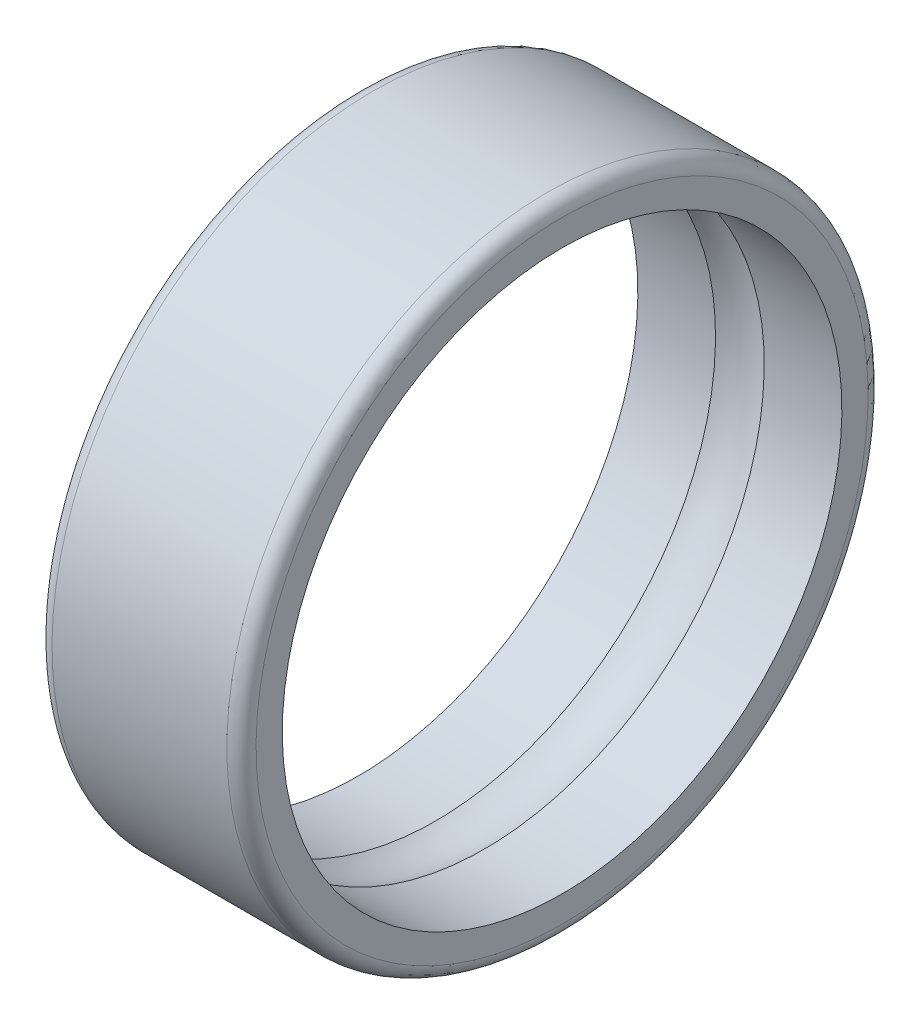
ISO-10303-21;
HEADER;
FILE_DESCRIPTION(('STEP AP214'),'2;1');
FILE_NAME('part.step','',(''),(''),'','','');
FILE_SCHEMA(('AUTOMOTIVE_DESIGN { 1 0 10303 214 1 1 1 1 }'));
ENDSEC;
DATA;
#1=APPLICATION_CONTEXT('core data for automotive mechanical design processes');
#2=APPLICATION_PROTOCOL_DEFINITION('international standard','automotive_design',2000,#1);
#3=PRODUCT_CONTEXT('',#1,'mechanical');
#4=PRODUCT('Part','Part','',(#3));
#5=PRODUCT_RELATED_PRODUCT_CATEGORY('part','',(#4));
#6=PRODUCT_DEFINITION_FORMATION('','',#4);
#7=PRODUCT_DEFINITION_CONTEXT('part definition',#1,'design');
#8=PRODUCT_DEFINITION('design','',#6,#7);
#9=PRODUCT_DEFINITION_SHAPE('','',#8);
#10=(LENGTH_UNIT() NAMED_UNIT(*) SI_UNIT(.MILLI.,.METRE.));
#11=(NAMED_UNIT(*) PLANE_ANGLE_UNIT() SI_UNIT($,.RADIAN.));
#12=(NAMED_UNIT(*) SI_UNIT($,.STERADIAN.) SOLID_ANGLE_UNIT());
#13=UNCERTAINTY_MEASURE_WITH_UNIT(LENGTH_MEASURE(1.E-05),#10,'distance_accuracy_value','');
#14=(GEOMETRIC_REPRESENTATION_CONTEXT(3) GLOBAL_UNCERTAINTY_ASSIGNED_CONTEXT((#13)) GLOBAL_UNIT_ASSIGNED_CONTEXT((#10,
#11,#12)) REPRESENTATION_CONTEXT('',''));
#15=CARTESIAN_POINT('',(0.,0.,0.));
#16=DIRECTION('',(0.,0.,1.));
#17=DIRECTION('',(1.,0.,0.));
#18=AXIS2_PLACEMENT_3D('',#15,#16,#17);
#19=CARTESIAN_POINT('',(0.,0.,0.));
#20=DIRECTION('',(1.,0.,0.));
#21=DIRECTION('',(0.,1.,0.));
#22=AXIS2_PLACEMENT_3D('',#19,#20,#21);
#23=TOROIDAL_SURFACE('',#22,7.8,1.9845);
#24=CARTESIAN_POINT('',(-0.835607712984986,0.,0.));
#25=DIRECTION('',(1.,0.,0.));
#26=DIRECTION('',(0.,1.,0.));
#27=AXIS2_PLACEMENT_3D('',#24,#25,#26);
#28=CIRCLE('',#27,9.6);
#29=CARTESIAN_POINT('',(-0.835607712984987,9.6,0.));
#30=VERTEX_POINT('',#29);
#31=EDGE_CURVE('E76',#30,#30,#28,.T.);
#32=ORIENTED_EDGE('',*,*,#31,.F.);
#33=EDGE_LOOP('',(#32));
#34=FACE_BOUND('',#33,.T.);
#35=CARTESIAN_POINT('',(0.835607712984986,0.,0.));
#36=DIRECTION('',(1.,0.,0.));
#37=DIRECTION('',(0.,1.,0.));
#38=AXIS2_PLACEMENT_3D('',#35,#36,#37);
#39=CIRCLE('',#38,9.6);
#40=CARTESIAN_POINT('',(0.835607712984984,9.6,0.));
#41=VERTEX_POINT('',#40);
#42=EDGE_CURVE('E67',#41,#41,#39,.T.);
#43=ORIENTED_EDGE('',*,*,#42,.T.);
#44=EDGE_LOOP('',(#43));
#45=FACE_BOUND('',#44,.T.);
#46=ADVANCED_FACE('F47',(#34,#45),#23,.F.);
#47=CARTESIAN_POINT('',(23.6601859567376,0.,0.));
#48=DIRECTION('',(1.,0.,0.));
#49=DIRECTION('',(0.,1.,0.));
#50=AXIS2_PLACEMENT_3D('',#47,#48,#49);
#51=CYLINDRICAL_SURFACE('',#50,9.6);
#52=ORIENTED_EDGE('',*,*,#42,.F.);
#53=EDGE_LOOP('',(#52));
#54=FACE_BOUND('',#53,.T.);
#55=CARTESIAN_POINT('',(3.5,0.,0.));
#56=DIRECTION('',(1.,0.,0.));
#57=DIRECTION('',(0.,1.,0.));
#58=AXIS2_PLACEMENT_3D('',#55,#56,#57);
#59=CIRCLE('',#58,9.6);
#60=CARTESIAN_POINT('',(3.5,9.6,0.));
#61=VERTEX_POINT('',#60);
#62=EDGE_CURVE('E70',#61,#61,#59,.T.);
#63=ORIENTED_EDGE('',*,*,#62,.T.);
#64=EDGE_LOOP('',(#63));
#65=FACE_BOUND('',#64,.T.);
#66=ADVANCED_FACE('F84',(#54,#65),#51,.F.);
#67=CARTESIAN_POINT('',(3.5,0.,0.));
#68=DIRECTION('',(-1.,0.,0.));
#69=DIRECTION('',(0.,-1.,0.));
#70=AXIS2_PLACEMENT_3D('',#67,#68,#69);
#71=PLANE('',#70);
#72=CARTESIAN_POINT('',(3.5,0.,0.));
#73=DIRECTION('',(-1.,0.,0.));
#74=DIRECTION('',(0.,-1.,0.));
#75=AXIS2_PLACEMENT_3D('',#72,#73,#74);
#76=CIRCLE('',#75,10.5);
#77=CARTESIAN_POINT('',(3.5,-10.5,0.));
#78=VERTEX_POINT('',#77);
#79=EDGE_CURVE('E12',#78,#78,#76,.F.);
#80=ORIENTED_EDGE('',*,*,#79,.T.);
#81=EDGE_LOOP('',(#80));
#82=FACE_BOUND('',#81,.T.);
#83=ORIENTED_EDGE('',*,*,#62,.F.);
#84=EDGE_LOOP('',(#83));
#85=FACE_BOUND('',#84,.T.);
#86=ADVANCED_FACE('F90',(#82,#85),#71,.F.);
#87=CARTESIAN_POINT('',(23.6601859567376,0.,0.));
#88=DIRECTION('',(1.,0.,0.));
#89=DIRECTION('',(0.,1.,0.));
#90=AXIS2_PLACEMENT_3D('',#87,#88,#89);
#91=CYLINDRICAL_SURFACE('',#90,11.);
#92=CARTESIAN_POINT('',(-3.,0.,0.));
#93=DIRECTION('',(1.,0.,0.));
#94=DIRECTION('',(0.,1.,0.));
#95=AXIS2_PLACEMENT_3D('',#92,#93,#94);
#96=CIRCLE('',#95,11.);
#97=CARTESIAN_POINT('',(-3.,11.,0.));
#98=VERTEX_POINT('',#97);
#99=EDGE_CURVE('E58',#98,#98,#96,.T.);
#100=ORIENTED_EDGE('',*,*,#99,.T.);
#101=EDGE_LOOP('',(#100));
#102=FACE_BOUND('',#101,.T.);
#103=CARTESIAN_POINT('',(3.,0.,0.));
#104=DIRECTION('',(-1.,0.,0.));
#105=DIRECTION('',(0.,-1.,0.));
#106=AXIS2_PLACEMENT_3D('',#103,#104,#105);
#107=CIRCLE('',#106,11.);
#108=CARTESIAN_POINT('',(3.,-11.,0.));
#109=VERTEX_POINT('',#108);
#110=EDGE_CURVE('E62',#109,#109,#107,.T.);
#111=ORIENTED_EDGE('',*,*,#110,.T.);
#112=EDGE_LOOP('',(#111));
#113=FACE_BOUND('',#112,.T.);
#114=ADVANCED_FACE('F95',(#102,#113),#91,.T.);
#115=CARTESIAN_POINT('',(-3.5,0.,0.));
#116=DIRECTION('',(1.,0.,0.));
#117=DIRECTION('',(0.,1.,0.));
#118=AXIS2_PLACEMENT_3D('',#115,#116,#117);
#119=PLANE('',#118);
#120=CARTESIAN_POINT('',(-3.5,0.,0.));
#121=DIRECTION('',(1.,0.,0.));
#122=DIRECTION('',(0.,1.,0.));
#123=AXIS2_PLACEMENT_3D('',#120,#121,#122);
#124=CIRCLE('',#123,10.5);
#125=CARTESIAN_POINT('',(-3.5,10.5,0.));
#126=VERTEX_POINT('',#125);
#127=EDGE_CURVE('E54',#126,#126,#124,.F.);
#128=ORIENTED_EDGE('',*,*,#127,.T.);
#129=EDGE_LOOP('',(#128));
#130=FACE_BOUND('',#129,.T.);
#131=CARTESIAN_POINT('',(-3.5,0.,0.));
#132=DIRECTION('',(1.,0.,0.));
#133=DIRECTION('',(0.,1.,0.));
#134=AXIS2_PLACEMENT_3D('',#131,#132,#133);
#135=CIRCLE('',#134,9.6);
#136=CARTESIAN_POINT('',(-3.5,9.6,0.));
#137=VERTEX_POINT('',#136);
#138=EDGE_CURVE('E73',#137,#137,#135,.T.);
#139=ORIENTED_EDGE('',*,*,#138,.T.);
#140=EDGE_LOOP('',(#139));
#141=FACE_BOUND('',#140,.T.);
#142=ADVANCED_FACE('F100',(#130,#141),#119,.F.);
#143=ORIENTED_EDGE('',*,*,#138,.F.);
#144=EDGE_LOOP('',(#143));
#145=FACE_BOUND('',#144,.T.);
#146=ORIENTED_EDGE('',*,*,#31,.T.);
#147=EDGE_LOOP('',(#146));
#148=FACE_BOUND('',#147,.T.);
#149=ADVANCED_FACE('F80',(#145,#148),#51,.F.);
#150=CARTESIAN_POINT('',(-3.,0.,0.));
#151=DIRECTION('',(1.,0.,0.));
#152=DIRECTION('',(0.,1.,0.));
#153=AXIS2_PLACEMENT_3D('',#150,#151,#152);
#154=TOROIDAL_SURFACE('',#153,10.5,0.5);
#155=ORIENTED_EDGE('',*,*,#127,.F.);
#156=EDGE_LOOP('',(#155));
#157=FACE_BOUND('',#156,.T.);
#158=ORIENTED_EDGE('',*,*,#99,.F.);
#159=EDGE_LOOP('',(#158));
#160=FACE_BOUND('',#159,.T.);
#161=ADVANCED_FACE('F104',(#157,#160),#154,.T.);
#162=CARTESIAN_POINT('',(3.,0.,0.));
#163=DIRECTION('',(-1.,0.,0.));
#164=DIRECTION('',(0.,-1.,0.));
#165=AXIS2_PLACEMENT_3D('',#162,#163,#164);
#166=TOROIDAL_SURFACE('',#165,10.5,0.5);
#167=ORIENTED_EDGE('',*,*,#110,.F.);
#168=EDGE_LOOP('',(#167));
#169=FACE_BOUND('',#168,.T.);
#170=ORIENTED_EDGE('',*,*,#79,.F.);
#171=EDGE_LOOP('',(#170));
#172=FACE_BOUND('',#171,.T.);
#173=ADVANCED_FACE('F49',(#169,#172),#166,.T.);
#174=CLOSED_SHELL('',(#46,#66,#86,#114,#142,#149,#161,#173));
#175=MANIFOLD_SOLID_BREP('B2',#174);
#176=ADVANCED_BREP_SHAPE_REPRESENTATION('',(#18,#175),#14);
#177=SHAPE_DEFINITION_REPRESENTATION(#9,#176);
ENDSEC;
END-ISO-10303-21;
